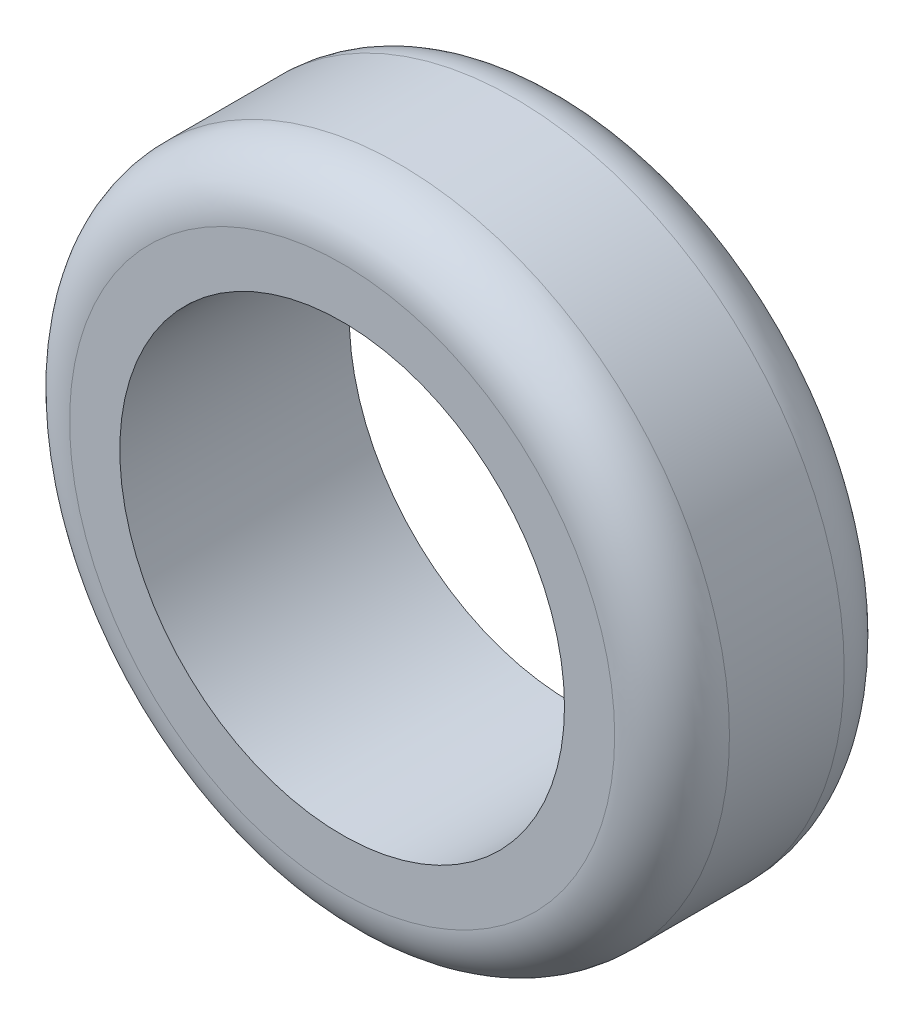
ISO-10303-21;
HEADER;
FILE_DESCRIPTION(('STEP AP214'),'2;1');
FILE_NAME('part.step','',(''),(''),'','','');
FILE_SCHEMA(('AUTOMOTIVE_DESIGN { 1 0 10303 214 1 1 1 1 }'));
ENDSEC;
DATA;
#1=APPLICATION_CONTEXT('core data for automotive mechanical design processes');
#2=APPLICATION_PROTOCOL_DEFINITION('international standard','automotive_design',2000,#1);
#3=PRODUCT_CONTEXT('',#1,'mechanical');
#4=PRODUCT('Part','Part','',(#3));
#5=PRODUCT_RELATED_PRODUCT_CATEGORY('part','',(#4));
#6=PRODUCT_DEFINITION_FORMATION('','',#4);
#7=PRODUCT_DEFINITION_CONTEXT('part definition',#1,'design');
#8=PRODUCT_DEFINITION('design','',#6,#7);
#9=PRODUCT_DEFINITION_SHAPE('','',#8);
#10=(LENGTH_UNIT() NAMED_UNIT(*) SI_UNIT(.MILLI.,.METRE.));
#11=(NAMED_UNIT(*) PLANE_ANGLE_UNIT() SI_UNIT($,.RADIAN.));
#12=(NAMED_UNIT(*) SI_UNIT($,.STERADIAN.) SOLID_ANGLE_UNIT());
#13=UNCERTAINTY_MEASURE_WITH_UNIT(LENGTH_MEASURE(1.E-05),#10,'distance_accuracy_value','');
#14=(GEOMETRIC_REPRESENTATION_CONTEXT(3) GLOBAL_UNCERTAINTY_ASSIGNED_CONTEXT((#13)) GLOBAL_UNIT_ASSIGNED_CONTEXT((#10,
#11,#12)) REPRESENTATION_CONTEXT('',''));
#15=CARTESIAN_POINT('',(0.,0.,0.));
#16=DIRECTION('',(0.,0.,1.));
#17=DIRECTION('',(1.,0.,0.));
#18=AXIS2_PLACEMENT_3D('',#15,#16,#17);
#19=CARTESIAN_POINT('',(0.,0.,4.));
#20=DIRECTION('',(0.,0.,-1.));
#21=DIRECTION('',(-1.,0.,0.));
#22=AXIS2_PLACEMENT_3D('',#19,#20,#21);
#23=CYLINDRICAL_SURFACE('',#22,11.5);
#24=CARTESIAN_POINT('',(0.,0.,-2.));
#25=DIRECTION('',(0.,0.,1.));
#26=DIRECTION('',(1.,0.,0.));
#27=AXIS2_PLACEMENT_3D('',#24,#25,#26);
#28=CIRCLE('',#27,11.5);
#29=CARTESIAN_POINT('',(11.5,0.,-2.));
#30=VERTEX_POINT('',#29);
#31=EDGE_CURVE('E199',#30,#30,#28,.T.);
#32=ORIENTED_EDGE('',*,*,#31,.T.);
#33=EDGE_LOOP('',(#32));
#34=FACE_BOUND('',#33,.T.);
#35=CARTESIAN_POINT('',(0.,0.,2.));
#36=DIRECTION('',(0.,0.,1.));
#37=DIRECTION('',(1.,0.,0.));
#38=AXIS2_PLACEMENT_3D('',#35,#36,#37);
#39=CIRCLE('',#38,11.5);
#40=CARTESIAN_POINT('',(11.5,0.,2.));
#41=VERTEX_POINT('',#40);
#42=EDGE_CURVE('E203',#41,#41,#39,.F.);
#43=ORIENTED_EDGE('',*,*,#42,.T.);
#44=EDGE_LOOP('',(#43));
#45=FACE_BOUND('',#44,.T.);
#46=ADVANCED_FACE('F188',(#34,#45),#23,.T.);
#47=CARTESIAN_POINT('',(0.,0.,4.));
#48=DIRECTION('',(0.,0.,1.));
#49=DIRECTION('',(1.,0.,0.));
#50=AXIS2_PLACEMENT_3D('',#47,#48,#49);
#51=PLANE('',#50);
#52=CARTESIAN_POINT('',(0.,0.,4.));
#53=DIRECTION('',(0.,0.,1.));
#54=DIRECTION('',(1.,0.,0.));
#55=AXIS2_PLACEMENT_3D('',#52,#53,#54);
#56=CIRCLE('',#55,9.5);
#57=CARTESIAN_POINT('',(9.5,0.,4.));
#58=VERTEX_POINT('',#57);
#59=EDGE_CURVE('E12',#58,#58,#56,.T.);
#60=ORIENTED_EDGE('',*,*,#59,.T.);
#61=EDGE_LOOP('',(#60));
#62=FACE_BOUND('',#61,.T.);
#63=CARTESIAN_POINT('',(0.,0.,4.));
#64=DIRECTION('',(0.,0.,1.));
#65=DIRECTION('',(1.,0.,0.));
#66=AXIS2_PLACEMENT_3D('',#63,#64,#65);
#67=CIRCLE('',#66,7.75);
#68=CARTESIAN_POINT('',(7.75,0.,4.));
#69=VERTEX_POINT('',#68);
#70=EDGE_CURVE('E211',#69,#69,#67,.T.);
#71=ORIENTED_EDGE('',*,*,#70,.F.);
#72=EDGE_LOOP('',(#71));
#73=FACE_BOUND('',#72,.T.);
#74=ADVANCED_FACE('F217',(#62,#73),#51,.T.);
#75=CARTESIAN_POINT('',(0.,0.,-4.));
#76=DIRECTION('',(0.,0.,1.));
#77=DIRECTION('',(1.,0.,0.));
#78=AXIS2_PLACEMENT_3D('',#75,#76,#77);
#79=PLANE('',#78);
#80=CARTESIAN_POINT('',(0.,0.,-4.));
#81=DIRECTION('',(0.,0.,1.));
#82=DIRECTION('',(1.,0.,0.));
#83=AXIS2_PLACEMENT_3D('',#80,#81,#82);
#84=CIRCLE('',#83,9.5);
#85=CARTESIAN_POINT('',(9.5,0.,-4.));
#86=VERTEX_POINT('',#85);
#87=EDGE_CURVE('E195',#86,#86,#84,.F.);
#88=ORIENTED_EDGE('',*,*,#87,.T.);
#89=EDGE_LOOP('',(#88));
#90=FACE_BOUND('',#89,.T.);
#91=CARTESIAN_POINT('',(0.,0.,-4.));
#92=DIRECTION('',(0.,0.,1.));
#93=DIRECTION('',(1.,0.,0.));
#94=AXIS2_PLACEMENT_3D('',#91,#92,#93);
#95=CIRCLE('',#94,7.75);
#96=CARTESIAN_POINT('',(7.75,0.,-4.));
#97=VERTEX_POINT('',#96);
#98=EDGE_CURVE('E208',#97,#97,#95,.F.);
#99=ORIENTED_EDGE('',*,*,#98,.F.);
#100=EDGE_LOOP('',(#99));
#101=FACE_BOUND('',#100,.T.);
#102=ADVANCED_FACE('F219',(#90,#101),#79,.F.);
#103=CARTESIAN_POINT('',(0.,0.,-2.));
#104=DIRECTION('',(0.,0.,1.));
#105=DIRECTION('',(1.,0.,0.));
#106=AXIS2_PLACEMENT_3D('',#103,#104,#105);
#107=TOROIDAL_SURFACE('',#106,9.5,2.);
#108=ORIENTED_EDGE('',*,*,#87,.F.);
#109=EDGE_LOOP('',(#108));
#110=FACE_BOUND('',#109,.T.);
#111=ORIENTED_EDGE('',*,*,#31,.F.);
#112=EDGE_LOOP('',(#111));
#113=FACE_BOUND('',#112,.T.);
#114=ADVANCED_FACE('F225',(#110,#113),#107,.T.);
#115=CARTESIAN_POINT('',(0.,0.,2.));
#116=DIRECTION('',(0.,0.,1.));
#117=DIRECTION('',(1.,0.,0.));
#118=AXIS2_PLACEMENT_3D('',#115,#116,#117);
#119=TOROIDAL_SURFACE('',#118,9.5,2.);
#120=ORIENTED_EDGE('',*,*,#42,.F.);
#121=EDGE_LOOP('',(#120));
#122=FACE_BOUND('',#121,.T.);
#123=ORIENTED_EDGE('',*,*,#59,.F.);
#124=EDGE_LOOP('',(#123));
#125=FACE_BOUND('',#124,.T.);
#126=ADVANCED_FACE('F190',(#122,#125),#119,.T.);
#127=CARTESIAN_POINT('',(0.,0.,-6.));
#128=DIRECTION('',(0.,0.,1.));
#129=DIRECTION('',(1.,0.,0.));
#130=AXIS2_PLACEMENT_3D('',#127,#128,#129);
#131=CYLINDRICAL_SURFACE('',#130,7.75);
#132=ORIENTED_EDGE('',*,*,#98,.T.);
#133=EDGE_LOOP('',(#132));
#134=FACE_BOUND('',#133,.T.);
#135=ORIENTED_EDGE('',*,*,#70,.T.);
#136=EDGE_LOOP('',(#135));
#137=FACE_BOUND('',#136,.T.);
#138=ADVANCED_FACE('F215',(#134,#137),#131,.F.);
#139=CLOSED_SHELL('',(#46,#74,#102,#114,#126,#138));
#140=MANIFOLD_SOLID_BREP('B2',#139);
#141=ADVANCED_BREP_SHAPE_REPRESENTATION('',(#18,#140),#14);
#142=SHAPE_DEFINITION_REPRESENTATION(#9,#141);
ENDSEC;
END-ISO-10303-21;
